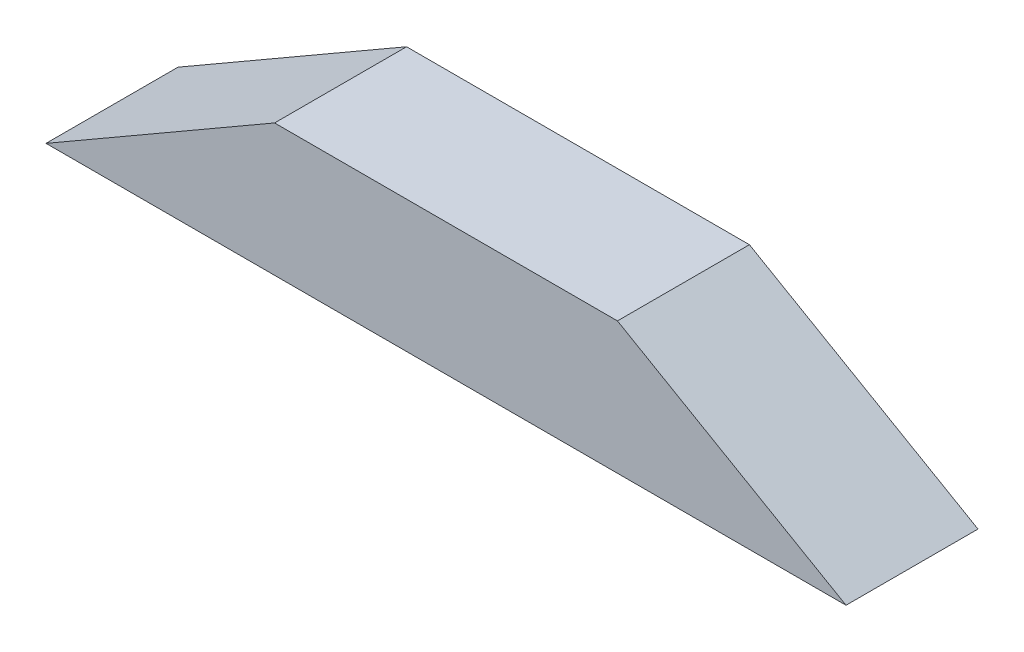
ISO-10303-21;
HEADER;
FILE_DESCRIPTION(('STEP AP214'),'2;1');
FILE_NAME('part.step','',(''),(''),'','','');
FILE_SCHEMA(('AUTOMOTIVE_DESIGN { 1 0 10303 214 1 1 1 1 }'));
ENDSEC;
DATA;
#1=APPLICATION_CONTEXT('core data for automotive mechanical design processes');
#2=APPLICATION_PROTOCOL_DEFINITION('international standard','automotive_design',2000,#1);
#3=PRODUCT_CONTEXT('',#1,'mechanical');
#4=PRODUCT('Part','Part','',(#3));
#5=PRODUCT_RELATED_PRODUCT_CATEGORY('part','',(#4));
#6=PRODUCT_DEFINITION_FORMATION('','',#4);
#7=PRODUCT_DEFINITION_CONTEXT('part definition',#1,'design');
#8=PRODUCT_DEFINITION('design','',#6,#7);
#9=PRODUCT_DEFINITION_SHAPE('','',#8);
#10=(LENGTH_UNIT() NAMED_UNIT(*) SI_UNIT(.MILLI.,.METRE.));
#11=(NAMED_UNIT(*) PLANE_ANGLE_UNIT() SI_UNIT($,.RADIAN.));
#12=(NAMED_UNIT(*) SI_UNIT($,.STERADIAN.) SOLID_ANGLE_UNIT());
#13=UNCERTAINTY_MEASURE_WITH_UNIT(LENGTH_MEASURE(1.E-05),#10,'distance_accuracy_value','');
#14=(GEOMETRIC_REPRESENTATION_CONTEXT(3) GLOBAL_UNCERTAINTY_ASSIGNED_CONTEXT((#13)) GLOBAL_UNIT_ASSIGNED_CONTEXT((#10,
#11,#12)) REPRESENTATION_CONTEXT('',''));
#15=CARTESIAN_POINT('',(0.,0.,0.));
#16=DIRECTION('',(0.,0.,1.));
#17=DIRECTION('',(1.,0.,0.));
#18=AXIS2_PLACEMENT_3D('',#15,#16,#17);
#19=CARTESIAN_POINT('',(13.8405774270742,23.9725833097825,10.));
#20=DIRECTION('',(0.500000000000016,0.86602540378443,0.));
#21=DIRECTION('',(-0.86602540378443,0.500000000000016,0.));
#22=AXIS2_PLACEMENT_3D('',#19,#20,#21);
#23=PLANE('',#22);
#24=DIRECTION('',(0.86602540378443,-0.500000000000016,0.));
#25=VECTOR('',#24,1.);
#26=CARTESIAN_POINT('',(13.8405774270742,23.9725833097825,0.));
#27=LINE('',#26,#25);
#28=CARTESIAN_POINT('',(251.221512324627,-113.07936335381,0.));
#29=VERTEX_POINT('',#28);
#30=CARTESIAN_POINT('',(268.542020400315,-123.07936335381,0.));
#31=VERTEX_POINT('',#30);
#32=EDGE_CURVE('E96',#29,#31,#27,.T.);
#33=ORIENTED_EDGE('',*,*,#32,.F.);
#34=DIRECTION('',(0.,0.,-1.));
#35=VECTOR('',#34,1.);
#36=CARTESIAN_POINT('',(251.221512324627,-113.07936335381,10.));
#37=LINE('',#36,#35);
#38=CARTESIAN_POINT('',(251.221512324627,-113.07936335381,10.));
#39=VERTEX_POINT('',#38);
#40=EDGE_CURVE('E11',#39,#29,#37,.T.);
#41=ORIENTED_EDGE('',*,*,#40,.F.);
#42=DIRECTION('',(0.86602540378443,-0.500000000000016,0.));
#43=VECTOR('',#42,1.);
#44=CARTESIAN_POINT('',(13.8405774270742,23.9725833097825,10.));
#45=LINE('',#44,#43);
#46=CARTESIAN_POINT('',(268.542020400315,-123.07936335381,10.));
#47=VERTEX_POINT('',#46);
#48=EDGE_CURVE('E81',#39,#47,#45,.T.);
#49=ORIENTED_EDGE('',*,*,#48,.T.);
#50=DIRECTION('',(0.,0.,-1.));
#51=VECTOR('',#50,1.);
#52=CARTESIAN_POINT('',(268.542020400315,-123.07936335381,10.));
#53=LINE('',#52,#51);
#54=EDGE_CURVE('E49',#47,#31,#53,.T.);
#55=ORIENTED_EDGE('',*,*,#54,.T.);
#56=EDGE_LOOP('',(#33,#41,#49,#55));
#57=FACE_BOUND('',#56,.T.);
#58=ADVANCED_FACE('F33',(#57),#23,.T.);
#59=CARTESIAN_POINT('',(0.,-113.07936335381,10.));
#60=DIRECTION('',(0.,-1.,0.));
#61=DIRECTION('',(0.,0.,-1.));
#62=AXIS2_PLACEMENT_3D('',#59,#60,#61);
#63=PLANE('',#62);
#64=DIRECTION('',(-1.,0.,0.));
#65=VECTOR('',#64,1.);
#66=CARTESIAN_POINT('',(0.,-113.07936335381,0.));
#67=LINE('',#66,#65);
#68=CARTESIAN_POINT('',(225.240750211092,-113.07936335381,0.));
#69=VERTEX_POINT('',#68);
#70=EDGE_CURVE('E87',#29,#69,#67,.T.);
#71=ORIENTED_EDGE('',*,*,#70,.T.);
#72=DIRECTION('',(0.,0.,-1.));
#73=VECTOR('',#72,1.);
#74=CARTESIAN_POINT('',(225.240750211092,-113.07936335381,10.));
#75=LINE('',#74,#73);
#76=CARTESIAN_POINT('',(225.240750211092,-113.07936335381,10.));
#77=VERTEX_POINT('',#76);
#78=EDGE_CURVE('E41',#77,#69,#75,.T.);
#79=ORIENTED_EDGE('',*,*,#78,.F.);
#80=DIRECTION('',(-1.,0.,0.));
#81=VECTOR('',#80,1.);
#82=CARTESIAN_POINT('',(0.,-113.07936335381,10.));
#83=LINE('',#82,#81);
#84=EDGE_CURVE('E75',#39,#77,#83,.T.);
#85=ORIENTED_EDGE('',*,*,#84,.F.);
#86=ORIENTED_EDGE('',*,*,#40,.T.);
#87=EDGE_LOOP('',(#71,#79,#85,#86));
#88=FACE_BOUND('',#87,.T.);
#89=ADVANCED_FACE('F85',(#88),#63,.F.);
#90=CARTESIAN_POINT('',(105.274988206858,-182.341628340493,10.));
#91=DIRECTION('',(-0.5,0.866025403784439,0.));
#92=DIRECTION('',(-0.866025403784439,-0.5,0.));
#93=AXIS2_PLACEMENT_3D('',#90,#91,#92);
#94=PLANE('',#93);
#95=DIRECTION('',(0.866025403784439,0.5,0.));
#96=VECTOR('',#95,1.);
#97=CARTESIAN_POINT('',(105.274988206858,-182.341628340493,0.));
#98=LINE('',#97,#96);
#99=CARTESIAN_POINT('',(207.920242135404,-123.07936335381,0.));
#100=VERTEX_POINT('',#99);
#101=EDGE_CURVE('E99',#100,#69,#98,.T.);
#102=ORIENTED_EDGE('',*,*,#101,.F.);
#103=DIRECTION('',(0.,0.,-1.));
#104=VECTOR('',#103,1.);
#105=CARTESIAN_POINT('',(207.920242135404,-123.07936335381,10.));
#106=LINE('',#105,#104);
#107=CARTESIAN_POINT('',(207.920242135404,-123.07936335381,10.));
#108=VERTEX_POINT('',#107);
#109=EDGE_CURVE('E62',#108,#100,#106,.T.);
#110=ORIENTED_EDGE('',*,*,#109,.F.);
#111=DIRECTION('',(0.866025403784439,0.5,0.));
#112=VECTOR('',#111,1.);
#113=CARTESIAN_POINT('',(105.274988206858,-182.341628340493,10.));
#114=LINE('',#113,#112);
#115=EDGE_CURVE('E80',#108,#77,#114,.T.);
#116=ORIENTED_EDGE('',*,*,#115,.T.);
#117=ORIENTED_EDGE('',*,*,#78,.T.);
#118=EDGE_LOOP('',(#102,#110,#116,#117));
#119=FACE_BOUND('',#118,.T.);
#120=ADVANCED_FACE('F90',(#119),#94,.T.);
#121=CARTESIAN_POINT('',(0.,-123.07936335381,10.));
#122=DIRECTION('',(0.,-1.,0.));
#123=DIRECTION('',(0.,0.,-1.));
#124=AXIS2_PLACEMENT_3D('',#121,#122,#123);
#125=PLANE('',#124);
#126=DIRECTION('',(-1.,0.,0.));
#127=VECTOR('',#126,1.);
#128=CARTESIAN_POINT('',(0.,-123.07936335381,0.));
#129=LINE('',#128,#127);
#130=EDGE_CURVE('E101',#31,#100,#129,.T.);
#131=ORIENTED_EDGE('',*,*,#130,.F.);
#132=ORIENTED_EDGE('',*,*,#54,.F.);
#133=DIRECTION('',(-1.,0.,0.));
#134=VECTOR('',#133,1.);
#135=CARTESIAN_POINT('',(0.,-123.07936335381,10.));
#136=LINE('',#135,#134);
#137=EDGE_CURVE('E91',#47,#108,#136,.T.);
#138=ORIENTED_EDGE('',*,*,#137,.T.);
#139=ORIENTED_EDGE('',*,*,#109,.T.);
#140=EDGE_LOOP('',(#131,#132,#138,#139));
#141=FACE_BOUND('',#140,.T.);
#142=ADVANCED_FACE('F106',(#141),#125,.T.);
#143=CARTESIAN_POINT('',(0.,0.,10.));
#144=DIRECTION('',(0.,0.,1.));
#145=DIRECTION('',(1.,0.,0.));
#146=AXIS2_PLACEMENT_3D('',#143,#144,#145);
#147=PLANE('',#146);
#148=ORIENTED_EDGE('',*,*,#48,.F.);
#149=ORIENTED_EDGE('',*,*,#84,.T.);
#150=ORIENTED_EDGE('',*,*,#115,.F.);
#151=ORIENTED_EDGE('',*,*,#137,.F.);
#152=EDGE_LOOP('',(#148,#149,#150,#151));
#153=FACE_BOUND('',#152,.T.);
#154=ADVANCED_FACE('F77',(#153),#147,.T.);
#155=CARTESIAN_POINT('',(0.,0.,0.));
#156=DIRECTION('',(0.,0.,1.));
#157=DIRECTION('',(1.,0.,0.));
#158=AXIS2_PLACEMENT_3D('',#155,#156,#157);
#159=PLANE('',#158);
#160=ORIENTED_EDGE('',*,*,#32,.T.);
#161=ORIENTED_EDGE('',*,*,#130,.T.);
#162=ORIENTED_EDGE('',*,*,#101,.T.);
#163=ORIENTED_EDGE('',*,*,#70,.F.);
#164=EDGE_LOOP('',(#160,#161,#162,#163));
#165=FACE_BOUND('',#164,.T.);
#166=ADVANCED_FACE('F113',(#165),#159,.F.);
#167=CLOSED_SHELL('',(#58,#89,#120,#142,#154,#166));
#168=MANIFOLD_SOLID_BREP('B2',#167);
#169=ADVANCED_BREP_SHAPE_REPRESENTATION('',(#18,#168),#14);
#170=SHAPE_DEFINITION_REPRESENTATION(#9,#169);
ENDSEC;
END-ISO-10303-21;
